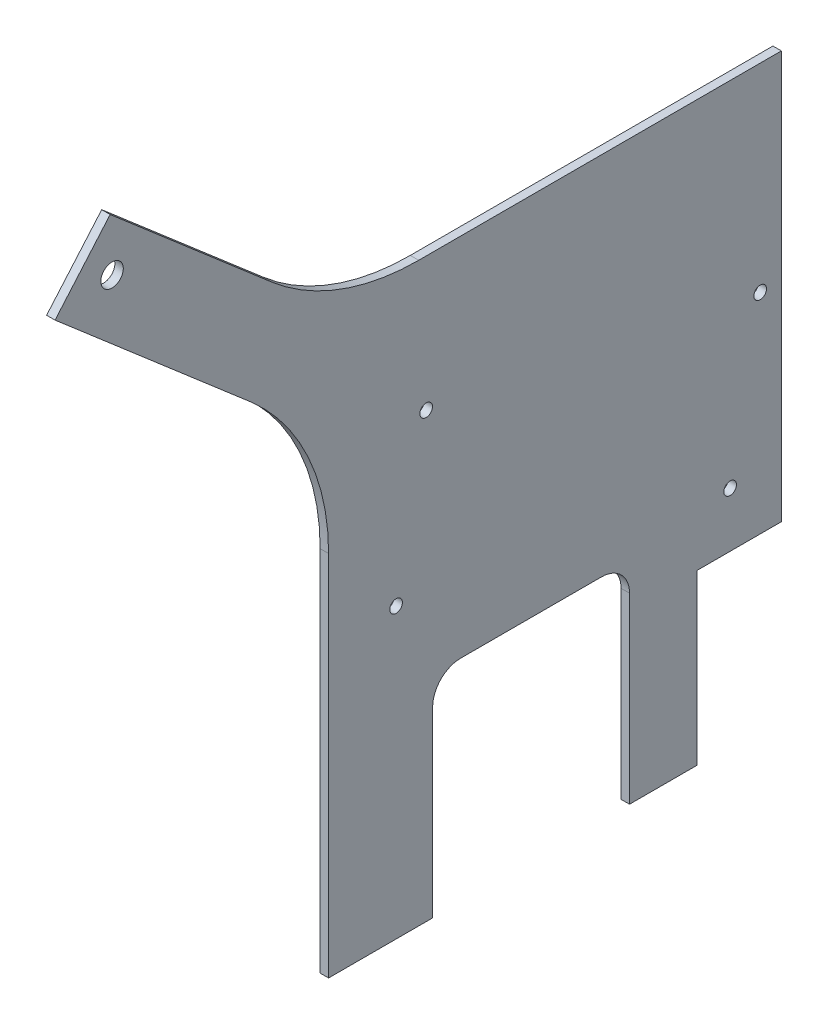
ISO-10303-21;
HEADER;
FILE_DESCRIPTION(('STEP AP214'),'2;1');
FILE_NAME('part.step','',(''),(''),'','','');
FILE_SCHEMA(('AUTOMOTIVE_DESIGN { 1 0 10303 214 1 1 1 1 }'));
ENDSEC;
DATA;
#1=APPLICATION_CONTEXT('core data for automotive mechanical design processes');
#2=APPLICATION_PROTOCOL_DEFINITION('international standard','automotive_design',2000,#1);
#3=PRODUCT_CONTEXT('',#1,'mechanical');
#4=PRODUCT('Part','Part','',(#3));
#5=PRODUCT_RELATED_PRODUCT_CATEGORY('part','',(#4));
#6=PRODUCT_DEFINITION_FORMATION('','',#4);
#7=PRODUCT_DEFINITION_CONTEXT('part definition',#1,'design');
#8=PRODUCT_DEFINITION('design','',#6,#7);
#9=PRODUCT_DEFINITION_SHAPE('','',#8);
#10=(LENGTH_UNIT() NAMED_UNIT(*) SI_UNIT(.MILLI.,.METRE.));
#11=(NAMED_UNIT(*) PLANE_ANGLE_UNIT() SI_UNIT($,.RADIAN.));
#12=(NAMED_UNIT(*) SI_UNIT($,.STERADIAN.) SOLID_ANGLE_UNIT());
#13=UNCERTAINTY_MEASURE_WITH_UNIT(LENGTH_MEASURE(1.E-05),#10,'distance_accuracy_value','');
#14=(GEOMETRIC_REPRESENTATION_CONTEXT(3) GLOBAL_UNCERTAINTY_ASSIGNED_CONTEXT((#13)) GLOBAL_UNIT_ASSIGNED_CONTEXT((#10,
#11,#12)) REPRESENTATION_CONTEXT('',''));
#15=CARTESIAN_POINT('',(0.,0.,0.));
#16=DIRECTION('',(0.,0.,1.));
#17=DIRECTION('',(1.,0.,0.));
#18=AXIS2_PLACEMENT_3D('',#15,#16,#17);
#19=CARTESIAN_POINT('',(1.5,0.,0.));
#20=DIRECTION('',(0.,1.,0.));
#21=DIRECTION('',(0.,0.,1.));
#22=AXIS2_PLACEMENT_3D('',#19,#20,#21);
#23=PLANE('',#22);
#24=DIRECTION('',(0.,0.,-1.));
#25=VECTOR('',#24,1.);
#26=CARTESIAN_POINT('',(-1.5,0.,0.));
#27=LINE('',#26,#25);
#28=CARTESIAN_POINT('',(-1.5,0.,0.));
#29=VERTEX_POINT('',#28);
#30=CARTESIAN_POINT('',(-1.5,0.,-37.));
#31=VERTEX_POINT('',#30);
#32=EDGE_CURVE('E310',#29,#31,#27,.T.);
#33=ORIENTED_EDGE('',*,*,#32,.T.);
#34=DIRECTION('',(1.,0.,0.));
#35=VECTOR('',#34,1.);
#36=CARTESIAN_POINT('',(-1.5,0.,-37.));
#37=LINE('',#36,#35);
#38=CARTESIAN_POINT('',(1.5,0.,-37.));
#39=VERTEX_POINT('',#38);
#40=EDGE_CURVE('E240',#31,#39,#37,.T.);
#41=ORIENTED_EDGE('',*,*,#40,.T.);
#42=DIRECTION('',(0.,0.,-1.));
#43=VECTOR('',#42,1.);
#44=CARTESIAN_POINT('',(1.5,0.,0.));
#45=LINE('',#44,#43);
#46=CARTESIAN_POINT('',(1.5,0.,0.));
#47=VERTEX_POINT('',#46);
#48=EDGE_CURVE('E285',#47,#39,#45,.T.);
#49=ORIENTED_EDGE('',*,*,#48,.F.);
#50=DIRECTION('',(-1.,0.,0.));
#51=VECTOR('',#50,1.);
#52=CARTESIAN_POINT('',(1.5,0.,0.));
#53=LINE('',#52,#51);
#54=EDGE_CURVE('E11',#47,#29,#53,.T.);
#55=ORIENTED_EDGE('',*,*,#54,.T.);
#56=EDGE_LOOP('',(#33,#41,#49,#55));
#57=FACE_BOUND('',#56,.T.);
#58=ADVANCED_FACE('F37',(#57),#23,.F.);
#59=CARTESIAN_POINT('',(1.5,130.720433702789,80.));
#60=DIRECTION('',(1.,0.,0.));
#61=DIRECTION('',(0.,0.,-1.));
#62=AXIS2_PLACEMENT_3D('',#59,#60,#61);
#63=PLANE('',#62);
#64=DIRECTION('',(0.,-1.,0.));
#65=VECTOR('',#64,1.);
#66=CARTESIAN_POINT('',(1.5,0.,-131.));
#67=LINE('',#66,#65);
#68=CARTESIAN_POINT('',(1.5,60.,-131.));
#69=VERTEX_POINT('',#68);
#70=CARTESIAN_POINT('',(1.5,0.,-131.));
#71=VERTEX_POINT('',#70);
#72=EDGE_CURVE('E193',#69,#71,#67,.T.);
#73=ORIENTED_EDGE('',*,*,#72,.F.);
#74=DIRECTION('',(0.,0.,1.));
#75=VECTOR('',#74,1.);
#76=CARTESIAN_POINT('',(1.5,60.,-161.));
#77=LINE('',#76,#75);
#78=CARTESIAN_POINT('',(1.5,60.,-161.));
#79=VERTEX_POINT('',#78);
#80=EDGE_CURVE('E173',#79,#69,#77,.T.);
#81=ORIENTED_EDGE('',*,*,#80,.F.);
#82=DIRECTION('',(0.,1.,0.));
#83=VECTOR('',#82,1.);
#84=CARTESIAN_POINT('',(1.5,0.,-161.));
#85=LINE('',#84,#83);
#86=CARTESIAN_POINT('',(1.5,205.,-161.));
#87=VERTEX_POINT('',#86);
#88=EDGE_CURVE('E289',#79,#87,#85,.T.);
#89=ORIENTED_EDGE('',*,*,#88,.T.);
#90=DIRECTION('',(0.,0.,1.));
#91=VECTOR('',#90,1.);
#92=CARTESIAN_POINT('',(1.5,205.,-32.0254453572531));
#93=LINE('',#92,#91);
#94=CARTESIAN_POINT('',(1.5,205.,-32.0254453572531));
#95=VERTEX_POINT('',#94);
#96=EDGE_CURVE('E291',#87,#95,#93,.T.);
#97=ORIENTED_EDGE('',*,*,#96,.T.);
#98=CARTESIAN_POINT('',(1.5,285.,-32.0254453572531));
#99=DIRECTION('',(-1.,0.,0.));
#100=DIRECTION('',(0.,0.,1.));
#101=AXIS2_PLACEMENT_3D('',#98,#99,#100);
#102=CIRCLE('',#101,80.);
#103=CARTESIAN_POINT('',(1.5,224.403033057894,20.2048868015352));
#104=VERTEX_POINT('',#103);
#105=EDGE_CURVE('E294',#95,#104,#102,.T.);
#106=ORIENTED_EDGE('',*,*,#105,.T.);
#107=DIRECTION('',(0.,0.652879151984854,0.75746208677632));
#108=VECTOR('',#107,1.);
#109=CARTESIAN_POINT('',(1.5,273.945625100142,77.6835718515051));
#110=LINE('',#109,#108);
#111=CARTESIAN_POINT('',(1.5,273.945625100142,77.6835718515051));
#112=VERTEX_POINT('',#111);
#113=EDGE_CURVE('E297',#104,#112,#110,.T.);
#114=ORIENTED_EDGE('',*,*,#113,.T.);
#115=DIRECTION('',(0.,-0.757462086776319,0.652879151984855));
#116=VECTOR('',#115,1.);
#117=CARTESIAN_POINT('',(1.5,251.221762496852,97.2699464110507));
#118=LINE('',#117,#116);
#119=CARTESIAN_POINT('',(1.5,251.221762496852,97.2699464110507));
#120=VERTEX_POINT('',#119);
#121=EDGE_CURVE('E299',#112,#120,#118,.T.);
#122=ORIENTED_EDGE('',*,*,#121,.T.);
#123=DIRECTION('',(0.,-0.652879151984855,-0.75746208677632));
#124=VECTOR('',#123,1.);
#125=CARTESIAN_POINT('',(1.5,191.317400644895,27.7696678412116));
#126=LINE('',#125,#124);
#127=CARTESIAN_POINT('',(1.5,191.317400644895,27.7696678412116));
#128=VERTEX_POINT('',#127);
#129=EDGE_CURVE('E301',#120,#128,#126,.T.);
#130=ORIENTED_EDGE('',*,*,#129,.T.);
#131=CARTESIAN_POINT('',(1.5,130.720433702789,80.));
#132=DIRECTION('',(-1.,0.,0.));
#133=DIRECTION('',(0.,0.,-1.));
#134=AXIS2_PLACEMENT_3D('',#131,#132,#133);
#135=CIRCLE('',#134,80.);
#136=CARTESIAN_POINT('',(1.5,130.720433702789,0.));
#137=VERTEX_POINT('',#136);
#138=EDGE_CURVE('E303',#128,#137,#135,.T.);
#139=ORIENTED_EDGE('',*,*,#138,.T.);
#140=DIRECTION('',(0.,-1.,0.));
#141=VECTOR('',#140,1.);
#142=CARTESIAN_POINT('',(1.5,0.,0.));
#143=LINE('',#142,#141);
#144=EDGE_CURVE('E279',#137,#47,#143,.T.);
#145=ORIENTED_EDGE('',*,*,#144,.T.);
#146=ORIENTED_EDGE('',*,*,#48,.T.);
#147=DIRECTION('',(0.,-1.,0.));
#148=VECTOR('',#147,1.);
#149=CARTESIAN_POINT('',(1.5,0.,-37.));
#150=LINE('',#149,#148);
#151=CARTESIAN_POINT('',(1.5,65.,-37.));
#152=VERTEX_POINT('',#151);
#153=EDGE_CURVE('E221',#152,#39,#150,.T.);
#154=ORIENTED_EDGE('',*,*,#153,.F.);
#155=CARTESIAN_POINT('',(1.5,65.,-47.));
#156=DIRECTION('',(1.,0.,0.));
#157=DIRECTION('',(0.,0.,-1.));
#158=AXIS2_PLACEMENT_3D('',#155,#156,#157);
#159=CIRCLE('',#158,10.);
#160=CARTESIAN_POINT('',(1.5,75.,-47.));
#161=VERTEX_POINT('',#160);
#162=EDGE_CURVE('E226',#161,#152,#159,.T.);
#163=ORIENTED_EDGE('',*,*,#162,.F.);
#164=DIRECTION('',(0.,0.,1.));
#165=VECTOR('',#164,1.);
#166=CARTESIAN_POINT('',(1.5,75.,-47.));
#167=LINE('',#166,#165);
#168=CARTESIAN_POINT('',(1.5,75.,-97.));
#169=VERTEX_POINT('',#168);
#170=EDGE_CURVE('E250',#169,#161,#167,.T.);
#171=ORIENTED_EDGE('',*,*,#170,.F.);
#172=CARTESIAN_POINT('',(1.5,65.,-97.));
#173=DIRECTION('',(1.,0.,0.));
#174=DIRECTION('',(0.,0.,1.));
#175=AXIS2_PLACEMENT_3D('',#172,#173,#174);
#176=CIRCLE('',#175,9.99999999999999);
#177=CARTESIAN_POINT('',(1.5,65.,-107.));
#178=VERTEX_POINT('',#177);
#179=EDGE_CURVE('E246',#178,#169,#176,.T.);
#180=ORIENTED_EDGE('',*,*,#179,.F.);
#181=DIRECTION('',(0.,1.,0.));
#182=VECTOR('',#181,1.);
#183=CARTESIAN_POINT('',(1.5,0.,-107.));
#184=LINE('',#183,#182);
#185=CARTESIAN_POINT('',(1.5,0.,-107.));
#186=VERTEX_POINT('',#185);
#187=EDGE_CURVE('E243',#186,#178,#184,.T.);
#188=ORIENTED_EDGE('',*,*,#187,.F.);
#189=EDGE_CURVE('E283',#186,#71,#45,.T.);
#190=ORIENTED_EDGE('',*,*,#189,.T.);
#191=EDGE_LOOP('',(#73,#81,#89,#97,#106,#114,#122,#130,#139,#145,#146,#154,#163,#171,#180,#188,#190));
#192=FACE_BOUND('',#191,.T.);
#193=CARTESIAN_POINT('',(1.5,157.500209204623,-34.69));
#194=DIRECTION('',(1.,0.,0.));
#195=DIRECTION('',(0.,0.,-1.));
#196=AXIS2_PLACEMENT_3D('',#193,#194,#195);
#197=CIRCLE('',#196,2.25);
#198=CARTESIAN_POINT('',(1.5,157.500209204623,-36.94));
#199=VERTEX_POINT('',#198);
#200=EDGE_CURVE('E200',#199,#199,#197,.T.);
#201=ORIENTED_EDGE('',*,*,#200,.F.);
#202=EDGE_LOOP('',(#201));
#203=FACE_BOUND('',#202,.T.);
#204=CARTESIAN_POINT('',(1.5,102.53,-24.));
#205=DIRECTION('',(1.,0.,0.));
#206=DIRECTION('',(0.,0.,-1.));
#207=AXIS2_PLACEMENT_3D('',#204,#205,#206);
#208=CIRCLE('',#207,2.25);
#209=CARTESIAN_POINT('',(1.5,102.53,-26.25));
#210=VERTEX_POINT('',#209);
#211=EDGE_CURVE('E206',#210,#210,#208,.T.);
#212=ORIENTED_EDGE('',*,*,#211,.F.);
#213=EDGE_LOOP('',(#212));
#214=FACE_BOUND('',#213,.T.);
#215=CARTESIAN_POINT('',(1.5,134.402173490337,-153.464916317131));
#216=DIRECTION('',(1.,0.,0.));
#217=DIRECTION('',(0.,0.,-1.));
#218=AXIS2_PLACEMENT_3D('',#215,#216,#217);
#219=CIRCLE('',#218,2.25);
#220=CARTESIAN_POINT('',(1.5,134.402173490337,-155.714916317131));
#221=VERTEX_POINT('',#220);
#222=EDGE_CURVE('E211',#221,#221,#219,.T.);
#223=ORIENTED_EDGE('',*,*,#222,.F.);
#224=EDGE_LOOP('',(#223));
#225=FACE_BOUND('',#224,.T.);
#226=CARTESIAN_POINT('',(1.5,79.4319642857143,-142.774916317131));
#227=DIRECTION('',(1.,0.,0.));
#228=DIRECTION('',(0.,0.,-1.));
#229=AXIS2_PLACEMENT_3D('',#226,#227,#228);
#230=CIRCLE('',#229,2.25);
#231=CARTESIAN_POINT('',(1.5,79.4319642857143,-145.024916317131));
#232=VERTEX_POINT('',#231);
#233=EDGE_CURVE('E215',#232,#232,#230,.T.);
#234=ORIENTED_EDGE('',*,*,#233,.F.);
#235=EDGE_LOOP('',(#234));
#236=FACE_BOUND('',#235,.T.);
#237=CARTESIAN_POINT('',(1.5,255.,77.));
#238=DIRECTION('',(1.,0.,0.));
#239=DIRECTION('',(0.,0.,-1.));
#240=AXIS2_PLACEMENT_3D('',#237,#238,#239);
#241=CIRCLE('',#240,4.00000000000001);
#242=CARTESIAN_POINT('',(1.5,255.,73.));
#243=VERTEX_POINT('',#242);
#244=EDGE_CURVE('E273',#243,#243,#241,.T.);
#245=ORIENTED_EDGE('',*,*,#244,.F.);
#246=EDGE_LOOP('',(#245));
#247=FACE_BOUND('',#246,.T.);
#248=ADVANCED_FACE('F370',(#192,#203,#214,#225,#236,#247),#63,.T.);
#249=CARTESIAN_POINT('',(-1.5,130.720433702789,80.));
#250=DIRECTION('',(1.,0.,0.));
#251=DIRECTION('',(0.,0.,-1.));
#252=AXIS2_PLACEMENT_3D('',#249,#250,#251);
#253=PLANE('',#252);
#254=CARTESIAN_POINT('',(-1.5,157.500209204623,-34.69));
#255=DIRECTION('',(1.,0.,0.));
#256=DIRECTION('',(0.,0.,-1.));
#257=AXIS2_PLACEMENT_3D('',#254,#255,#256);
#258=CIRCLE('',#257,2.25);
#259=CARTESIAN_POINT('',(-1.5,157.500209204623,-36.94));
#260=VERTEX_POINT('',#259);
#261=EDGE_CURVE('E41',#260,#260,#258,.T.);
#262=ORIENTED_EDGE('',*,*,#261,.T.);
#263=EDGE_LOOP('',(#262));
#264=FACE_BOUND('',#263,.T.);
#265=CARTESIAN_POINT('',(-1.5,102.53,-24.));
#266=DIRECTION('',(1.,0.,0.));
#267=DIRECTION('',(0.,0.,-1.));
#268=AXIS2_PLACEMENT_3D('',#265,#266,#267);
#269=CIRCLE('',#268,2.25);
#270=CARTESIAN_POINT('',(-1.5,102.53,-26.25));
#271=VERTEX_POINT('',#270);
#272=EDGE_CURVE('E210',#271,#271,#269,.T.);
#273=ORIENTED_EDGE('',*,*,#272,.T.);
#274=EDGE_LOOP('',(#273));
#275=FACE_BOUND('',#274,.T.);
#276=CARTESIAN_POINT('',(-1.5,134.402173490337,-153.464916317131));
#277=DIRECTION('',(1.,0.,0.));
#278=DIRECTION('',(0.,0.,-1.));
#279=AXIS2_PLACEMENT_3D('',#276,#277,#278);
#280=CIRCLE('',#279,2.25);
#281=CARTESIAN_POINT('',(-1.5,134.402173490337,-155.714916317131));
#282=VERTEX_POINT('',#281);
#283=EDGE_CURVE('E214',#282,#282,#280,.T.);
#284=ORIENTED_EDGE('',*,*,#283,.T.);
#285=EDGE_LOOP('',(#284));
#286=FACE_BOUND('',#285,.T.);
#287=CARTESIAN_POINT('',(-1.5,79.4319642857143,-142.774916317131));
#288=DIRECTION('',(1.,0.,0.));
#289=DIRECTION('',(0.,0.,-1.));
#290=AXIS2_PLACEMENT_3D('',#287,#288,#289);
#291=CIRCLE('',#290,2.25);
#292=CARTESIAN_POINT('',(-1.5,79.4319642857143,-145.024916317131));
#293=VERTEX_POINT('',#292);
#294=EDGE_CURVE('E218',#293,#293,#291,.T.);
#295=ORIENTED_EDGE('',*,*,#294,.T.);
#296=EDGE_LOOP('',(#295));
#297=FACE_BOUND('',#296,.T.);
#298=DIRECTION('',(0.,0.,1.));
#299=VECTOR('',#298,1.);
#300=CARTESIAN_POINT('',(-1.5,60.,-161.));
#301=LINE('',#300,#299);
#302=CARTESIAN_POINT('',(-1.5,60.,-161.));
#303=VERTEX_POINT('',#302);
#304=CARTESIAN_POINT('',(-1.5,60.,-131.));
#305=VERTEX_POINT('',#304);
#306=EDGE_CURVE('E55',#303,#305,#301,.T.);
#307=ORIENTED_EDGE('',*,*,#306,.T.);
#308=DIRECTION('',(0.,-1.,0.));
#309=VECTOR('',#308,1.);
#310=CARTESIAN_POINT('',(-1.5,0.,-131.));
#311=LINE('',#310,#309);
#312=CARTESIAN_POINT('',(-1.5,0.,-131.));
#313=VERTEX_POINT('',#312);
#314=EDGE_CURVE('E180',#305,#313,#311,.T.);
#315=ORIENTED_EDGE('',*,*,#314,.T.);
#316=CARTESIAN_POINT('',(-1.5,0.,-107.));
#317=VERTEX_POINT('',#316);
#318=EDGE_CURVE('E309',#317,#313,#27,.T.);
#319=ORIENTED_EDGE('',*,*,#318,.F.);
#320=DIRECTION('',(0.,1.,0.));
#321=VECTOR('',#320,1.);
#322=CARTESIAN_POINT('',(-1.5,0.,-107.));
#323=LINE('',#322,#321);
#324=CARTESIAN_POINT('',(-1.5,65.,-107.));
#325=VERTEX_POINT('',#324);
#326=EDGE_CURVE('E63',#317,#325,#323,.T.);
#327=ORIENTED_EDGE('',*,*,#326,.T.);
#328=CARTESIAN_POINT('',(-1.5,65.,-97.));
#329=DIRECTION('',(1.,0.,0.));
#330=DIRECTION('',(0.,0.,1.));
#331=AXIS2_PLACEMENT_3D('',#328,#329,#330);
#332=CIRCLE('',#331,9.99999999999999);
#333=CARTESIAN_POINT('',(-1.5,75.,-97.));
#334=VERTEX_POINT('',#333);
#335=EDGE_CURVE('E228',#325,#334,#332,.T.);
#336=ORIENTED_EDGE('',*,*,#335,.T.);
#337=DIRECTION('',(0.,0.,1.));
#338=VECTOR('',#337,1.);
#339=CARTESIAN_POINT('',(-1.5,75.,-47.));
#340=LINE('',#339,#338);
#341=CARTESIAN_POINT('',(-1.5,75.,-47.));
#342=VERTEX_POINT('',#341);
#343=EDGE_CURVE('E232',#334,#342,#340,.T.);
#344=ORIENTED_EDGE('',*,*,#343,.T.);
#345=CARTESIAN_POINT('',(-1.5,65.,-47.));
#346=DIRECTION('',(1.,0.,0.));
#347=DIRECTION('',(0.,0.,-1.));
#348=AXIS2_PLACEMENT_3D('',#345,#346,#347);
#349=CIRCLE('',#348,10.);
#350=CARTESIAN_POINT('',(-1.5,65.,-37.));
#351=VERTEX_POINT('',#350);
#352=EDGE_CURVE('E236',#342,#351,#349,.T.);
#353=ORIENTED_EDGE('',*,*,#352,.T.);
#354=DIRECTION('',(0.,-1.,0.));
#355=VECTOR('',#354,1.);
#356=CARTESIAN_POINT('',(-1.5,0.,-37.));
#357=LINE('',#356,#355);
#358=EDGE_CURVE('E222',#351,#31,#357,.T.);
#359=ORIENTED_EDGE('',*,*,#358,.T.);
#360=ORIENTED_EDGE('',*,*,#32,.F.);
#361=DIRECTION('',(0.,-1.,0.));
#362=VECTOR('',#361,1.);
#363=CARTESIAN_POINT('',(-1.5,0.,0.));
#364=LINE('',#363,#362);
#365=CARTESIAN_POINT('',(-1.5,130.720433702789,0.));
#366=VERTEX_POINT('',#365);
#367=EDGE_CURVE('E276',#366,#29,#364,.T.);
#368=ORIENTED_EDGE('',*,*,#367,.F.);
#369=CARTESIAN_POINT('',(-1.5,130.720433702789,80.));
#370=DIRECTION('',(-1.,0.,0.));
#371=DIRECTION('',(0.,0.,-1.));
#372=AXIS2_PLACEMENT_3D('',#369,#370,#371);
#373=CIRCLE('',#372,80.);
#374=CARTESIAN_POINT('',(-1.5,191.317400644895,27.7696678412116));
#375=VERTEX_POINT('',#374);
#376=EDGE_CURVE('E284',#375,#366,#373,.T.);
#377=ORIENTED_EDGE('',*,*,#376,.F.);
#378=DIRECTION('',(0.,-0.652879151984855,-0.75746208677632));
#379=VECTOR('',#378,1.);
#380=CARTESIAN_POINT('',(-1.5,191.317400644895,27.7696678412116));
#381=LINE('',#380,#379);
#382=CARTESIAN_POINT('',(-1.5,251.221762496852,97.2699464110507));
#383=VERTEX_POINT('',#382);
#384=EDGE_CURVE('E325',#383,#375,#381,.T.);
#385=ORIENTED_EDGE('',*,*,#384,.F.);
#386=DIRECTION('',(0.,-0.757462086776319,0.652879151984855));
#387=VECTOR('',#386,1.);
#388=CARTESIAN_POINT('',(-1.5,251.221762496852,97.2699464110507));
#389=LINE('',#388,#387);
#390=CARTESIAN_POINT('',(-1.5,273.945625100142,77.6835718515051));
#391=VERTEX_POINT('',#390);
#392=EDGE_CURVE('E323',#391,#383,#389,.T.);
#393=ORIENTED_EDGE('',*,*,#392,.F.);
#394=DIRECTION('',(0.,0.652879151984854,0.75746208677632));
#395=VECTOR('',#394,1.);
#396=CARTESIAN_POINT('',(-1.5,273.945625100142,77.6835718515051));
#397=LINE('',#396,#395);
#398=CARTESIAN_POINT('',(-1.5,224.403033057894,20.2048868015352));
#399=VERTEX_POINT('',#398);
#400=EDGE_CURVE('E321',#399,#391,#397,.T.);
#401=ORIENTED_EDGE('',*,*,#400,.F.);
#402=CARTESIAN_POINT('',(-1.5,285.,-32.0254453572531));
#403=DIRECTION('',(-1.,0.,0.));
#404=DIRECTION('',(0.,0.,1.));
#405=AXIS2_PLACEMENT_3D('',#402,#403,#404);
#406=CIRCLE('',#405,80.);
#407=CARTESIAN_POINT('',(-1.5,205.,-32.0254453572531));
#408=VERTEX_POINT('',#407);
#409=EDGE_CURVE('E318',#408,#399,#406,.T.);
#410=ORIENTED_EDGE('',*,*,#409,.F.);
#411=DIRECTION('',(0.,0.,1.));
#412=VECTOR('',#411,1.);
#413=CARTESIAN_POINT('',(-1.5,205.,-32.0254453572531));
#414=LINE('',#413,#412);
#415=CARTESIAN_POINT('',(-1.5,205.,-161.));
#416=VERTEX_POINT('',#415);
#417=EDGE_CURVE('E315',#416,#408,#414,.T.);
#418=ORIENTED_EDGE('',*,*,#417,.F.);
#419=DIRECTION('',(0.,1.,0.));
#420=VECTOR('',#419,1.);
#421=CARTESIAN_POINT('',(-1.5,0.,-161.));
#422=LINE('',#421,#420);
#423=EDGE_CURVE('E192',#303,#416,#422,.T.);
#424=ORIENTED_EDGE('',*,*,#423,.F.);
#425=EDGE_LOOP('',(#307,#315,#319,#327,#336,#344,#353,#359,#360,#368,#377,#385,#393,#401,#410,
#418,#424));
#426=FACE_BOUND('',#425,.T.);
#427=CARTESIAN_POINT('',(-1.5,255.,77.));
#428=DIRECTION('',(1.,0.,0.));
#429=DIRECTION('',(0.,0.,-1.));
#430=AXIS2_PLACEMENT_3D('',#427,#428,#429);
#431=CIRCLE('',#430,4.00000000000001);
#432=CARTESIAN_POINT('',(-1.5,255.,73.));
#433=VERTEX_POINT('',#432);
#434=EDGE_CURVE('E260',#433,#433,#431,.T.);
#435=ORIENTED_EDGE('',*,*,#434,.T.);
#436=EDGE_LOOP('',(#435));
#437=FACE_BOUND('',#436,.T.);
#438=ADVANCED_FACE('F189',(#264,#275,#286,#297,#426,#437),#253,.F.);
#439=CARTESIAN_POINT('',(1.5,0.,0.));
#440=DIRECTION('',(0.,0.,-1.));
#441=DIRECTION('',(-1.,0.,0.));
#442=AXIS2_PLACEMENT_3D('',#439,#440,#441);
#443=PLANE('',#442);
#444=ORIENTED_EDGE('',*,*,#367,.T.);
#445=ORIENTED_EDGE('',*,*,#54,.F.);
#446=ORIENTED_EDGE('',*,*,#144,.F.);
#447=DIRECTION('',(-1.,0.,0.));
#448=VECTOR('',#447,1.);
#449=CARTESIAN_POINT('',(1.5,130.720433702789,0.));
#450=LINE('',#449,#448);
#451=EDGE_CURVE('E305',#137,#366,#450,.T.);
#452=ORIENTED_EDGE('',*,*,#451,.T.);
#453=EDGE_LOOP('',(#444,#445,#446,#452));
#454=FACE_BOUND('',#453,.T.);
#455=ADVANCED_FACE('F39',(#454),#443,.F.);
#456=ORIENTED_EDGE('',*,*,#318,.T.);
#457=DIRECTION('',(1.,0.,0.));
#458=VECTOR('',#457,1.);
#459=CARTESIAN_POINT('',(-1.5,0.,-131.));
#460=LINE('',#459,#458);
#461=EDGE_CURVE('E176',#313,#71,#460,.T.);
#462=ORIENTED_EDGE('',*,*,#461,.T.);
#463=ORIENTED_EDGE('',*,*,#189,.F.);
#464=DIRECTION('',(1.,0.,0.));
#465=VECTOR('',#464,1.);
#466=CARTESIAN_POINT('',(-1.5,0.,-107.));
#467=LINE('',#466,#465);
#468=EDGE_CURVE('E269',#317,#186,#467,.T.);
#469=ORIENTED_EDGE('',*,*,#468,.F.);
#470=EDGE_LOOP('',(#456,#462,#463,#469));
#471=FACE_BOUND('',#470,.T.);
#472=ADVANCED_FACE('F372',(#471),#23,.F.);
#473=CARTESIAN_POINT('',(1.5,0.,-161.));
#474=DIRECTION('',(0.,0.,1.));
#475=DIRECTION('',(1.,0.,0.));
#476=AXIS2_PLACEMENT_3D('',#473,#474,#475);
#477=PLANE('',#476);
#478=ORIENTED_EDGE('',*,*,#88,.F.);
#479=DIRECTION('',(1.,0.,0.));
#480=VECTOR('',#479,1.);
#481=CARTESIAN_POINT('',(-1.5,60.,-161.));
#482=LINE('',#481,#480);
#483=EDGE_CURVE('E177',#303,#79,#482,.T.);
#484=ORIENTED_EDGE('',*,*,#483,.F.);
#485=ORIENTED_EDGE('',*,*,#423,.T.);
#486=DIRECTION('',(-1.,0.,0.));
#487=VECTOR('',#486,1.);
#488=CARTESIAN_POINT('',(1.5,205.,-161.));
#489=LINE('',#488,#487);
#490=EDGE_CURVE('E47',#87,#416,#489,.T.);
#491=ORIENTED_EDGE('',*,*,#490,.F.);
#492=EDGE_LOOP('',(#478,#484,#485,#491));
#493=FACE_BOUND('',#492,.T.);
#494=ADVANCED_FACE('F380',(#493),#477,.F.);
#495=CARTESIAN_POINT('',(1.5,205.,-32.0254453572531));
#496=DIRECTION('',(0.,-1.,0.));
#497=DIRECTION('',(0.,0.,-1.));
#498=AXIS2_PLACEMENT_3D('',#495,#496,#497);
#499=PLANE('',#498);
#500=ORIENTED_EDGE('',*,*,#417,.T.);
#501=DIRECTION('',(-1.,0.,0.));
#502=VECTOR('',#501,1.);
#503=CARTESIAN_POINT('',(1.5,205.,-32.0254453572531));
#504=LINE('',#503,#502);
#505=EDGE_CURVE('E342',#95,#408,#504,.T.);
#506=ORIENTED_EDGE('',*,*,#505,.F.);
#507=ORIENTED_EDGE('',*,*,#96,.F.);
#508=ORIENTED_EDGE('',*,*,#490,.T.);
#509=EDGE_LOOP('',(#500,#506,#507,#508));
#510=FACE_BOUND('',#509,.T.);
#511=ADVANCED_FACE('F386',(#510),#499,.F.);
#512=CARTESIAN_POINT('',(1.5,285.,-32.0254453572531));
#513=DIRECTION('',(-1.,0.,0.));
#514=DIRECTION('',(0.,0.,1.));
#515=AXIS2_PLACEMENT_3D('',#512,#513,#514);
#516=CYLINDRICAL_SURFACE('',#515,80.);
#517=ORIENTED_EDGE('',*,*,#409,.T.);
#518=DIRECTION('',(-1.,0.,0.));
#519=VECTOR('',#518,1.);
#520=CARTESIAN_POINT('',(1.5,224.403033057894,20.2048868015352));
#521=LINE('',#520,#519);
#522=EDGE_CURVE('E339',#104,#399,#521,.T.);
#523=ORIENTED_EDGE('',*,*,#522,.F.);
#524=ORIENTED_EDGE('',*,*,#105,.F.);
#525=ORIENTED_EDGE('',*,*,#505,.T.);
#526=EDGE_LOOP('',(#517,#523,#524,#525));
#527=FACE_BOUND('',#526,.T.);
#528=ADVANCED_FACE('F420',(#527),#516,.F.);
#529=CARTESIAN_POINT('',(1.5,273.945625100142,77.6835718515051));
#530=DIRECTION('',(0.,-0.75746208677632,0.652879151984854));
#531=DIRECTION('',(0.,-0.652879151984854,-0.75746208677632));
#532=AXIS2_PLACEMENT_3D('',#529,#530,#531);
#533=PLANE('',#532);
#534=ORIENTED_EDGE('',*,*,#400,.T.);
#535=DIRECTION('',(-1.,0.,0.));
#536=VECTOR('',#535,1.);
#537=CARTESIAN_POINT('',(1.5,273.945625100142,77.6835718515051));
#538=LINE('',#537,#536);
#539=EDGE_CURVE('E336',#112,#391,#538,.T.);
#540=ORIENTED_EDGE('',*,*,#539,.F.);
#541=ORIENTED_EDGE('',*,*,#113,.F.);
#542=ORIENTED_EDGE('',*,*,#522,.T.);
#543=EDGE_LOOP('',(#534,#540,#541,#542));
#544=FACE_BOUND('',#543,.T.);
#545=ADVANCED_FACE('F416',(#544),#533,.F.);
#546=CARTESIAN_POINT('',(1.5,251.221762496852,97.2699464110507));
#547=DIRECTION('',(0.,-0.652879151984855,-0.757462086776319));
#548=DIRECTION('',(0.,0.757462086776319,-0.652879151984855));
#549=AXIS2_PLACEMENT_3D('',#546,#547,#548);
#550=PLANE('',#549);
#551=ORIENTED_EDGE('',*,*,#392,.T.);
#552=DIRECTION('',(-1.,0.,0.));
#553=VECTOR('',#552,1.);
#554=CARTESIAN_POINT('',(1.5,251.221762496852,97.2699464110507));
#555=LINE('',#554,#553);
#556=EDGE_CURVE('E333',#120,#383,#555,.T.);
#557=ORIENTED_EDGE('',*,*,#556,.F.);
#558=ORIENTED_EDGE('',*,*,#121,.F.);
#559=ORIENTED_EDGE('',*,*,#539,.T.);
#560=EDGE_LOOP('',(#551,#557,#558,#559));
#561=FACE_BOUND('',#560,.T.);
#562=ADVANCED_FACE('F412',(#561),#550,.F.);
#563=CARTESIAN_POINT('',(1.5,191.317400644895,27.7696678412116));
#564=DIRECTION('',(0.,0.75746208677632,-0.652879151984855));
#565=DIRECTION('',(0.,0.652879151984855,0.75746208677632));
#566=AXIS2_PLACEMENT_3D('',#563,#564,#565);
#567=PLANE('',#566);
#568=ORIENTED_EDGE('',*,*,#384,.T.);
#569=DIRECTION('',(-1.,0.,0.));
#570=VECTOR('',#569,1.);
#571=CARTESIAN_POINT('',(1.5,191.317400644895,27.7696678412116));
#572=LINE('',#571,#570);
#573=EDGE_CURVE('E330',#128,#375,#572,.T.);
#574=ORIENTED_EDGE('',*,*,#573,.F.);
#575=ORIENTED_EDGE('',*,*,#129,.F.);
#576=ORIENTED_EDGE('',*,*,#556,.T.);
#577=EDGE_LOOP('',(#568,#574,#575,#576));
#578=FACE_BOUND('',#577,.T.);
#579=ADVANCED_FACE('F408',(#578),#567,.F.);
#580=CARTESIAN_POINT('',(1.5,130.720433702789,80.));
#581=DIRECTION('',(-1.,0.,0.));
#582=DIRECTION('',(0.,0.,1.));
#583=AXIS2_PLACEMENT_3D('',#580,#581,#582);
#584=CYLINDRICAL_SURFACE('',#583,80.);
#585=ORIENTED_EDGE('',*,*,#376,.T.);
#586=ORIENTED_EDGE('',*,*,#451,.F.);
#587=ORIENTED_EDGE('',*,*,#138,.F.);
#588=ORIENTED_EDGE('',*,*,#573,.T.);
#589=EDGE_LOOP('',(#585,#586,#587,#588));
#590=FACE_BOUND('',#589,.T.);
#591=ADVANCED_FACE('F404',(#590),#584,.F.);
#592=CARTESIAN_POINT('',(1.5,255.,77.));
#593=DIRECTION('',(-1.,0.,0.));
#594=DIRECTION('',(0.,0.,1.));
#595=AXIS2_PLACEMENT_3D('',#592,#593,#594);
#596=CYLINDRICAL_SURFACE('',#595,4.00000000000001);
#597=ORIENTED_EDGE('',*,*,#244,.T.);
#598=EDGE_LOOP('',(#597));
#599=FACE_BOUND('',#598,.T.);
#600=ORIENTED_EDGE('',*,*,#434,.F.);
#601=EDGE_LOOP('',(#600));
#602=FACE_BOUND('',#601,.T.);
#603=ADVANCED_FACE('F407',(#599,#602),#596,.F.);
#604=CARTESIAN_POINT('',(-1.5,0.,-37.));
#605=DIRECTION('',(0.,0.,1.));
#606=DIRECTION('',(1.,0.,0.));
#607=AXIS2_PLACEMENT_3D('',#604,#605,#606);
#608=PLANE('',#607);
#609=ORIENTED_EDGE('',*,*,#153,.T.);
#610=ORIENTED_EDGE('',*,*,#40,.F.);
#611=ORIENTED_EDGE('',*,*,#358,.F.);
#612=DIRECTION('',(1.,0.,0.));
#613=VECTOR('',#612,1.);
#614=CARTESIAN_POINT('',(-1.5,65.,-37.));
#615=LINE('',#614,#613);
#616=EDGE_CURVE('E257',#351,#152,#615,.T.);
#617=ORIENTED_EDGE('',*,*,#616,.T.);
#618=EDGE_LOOP('',(#609,#610,#611,#617));
#619=FACE_BOUND('',#618,.T.);
#620=ADVANCED_FACE('F463',(#619),#608,.F.);
#621=CARTESIAN_POINT('',(-1.5,65.,-47.));
#622=DIRECTION('',(1.,0.,0.));
#623=DIRECTION('',(0.,0.,-1.));
#624=AXIS2_PLACEMENT_3D('',#621,#622,#623);
#625=CYLINDRICAL_SURFACE('',#624,10.);
#626=ORIENTED_EDGE('',*,*,#162,.T.);
#627=ORIENTED_EDGE('',*,*,#616,.F.);
#628=ORIENTED_EDGE('',*,*,#352,.F.);
#629=DIRECTION('',(1.,0.,0.));
#630=VECTOR('',#629,1.);
#631=CARTESIAN_POINT('',(-1.5,75.,-47.));
#632=LINE('',#631,#630);
#633=EDGE_CURVE('E261',#342,#161,#632,.T.);
#634=ORIENTED_EDGE('',*,*,#633,.T.);
#635=EDGE_LOOP('',(#626,#627,#628,#634));
#636=FACE_BOUND('',#635,.T.);
#637=ADVANCED_FACE('F459',(#636),#625,.F.);
#638=CARTESIAN_POINT('',(-1.5,75.,-47.));
#639=DIRECTION('',(0.,1.,0.));
#640=DIRECTION('',(0.,0.,1.));
#641=AXIS2_PLACEMENT_3D('',#638,#639,#640);
#642=PLANE('',#641);
#643=ORIENTED_EDGE('',*,*,#170,.T.);
#644=ORIENTED_EDGE('',*,*,#633,.F.);
#645=ORIENTED_EDGE('',*,*,#343,.F.);
#646=DIRECTION('',(1.,0.,0.));
#647=VECTOR('',#646,1.);
#648=CARTESIAN_POINT('',(-1.5,75.,-97.));
#649=LINE('',#648,#647);
#650=EDGE_CURVE('E264',#334,#169,#649,.T.);
#651=ORIENTED_EDGE('',*,*,#650,.T.);
#652=EDGE_LOOP('',(#643,#644,#645,#651));
#653=FACE_BOUND('',#652,.T.);
#654=ADVANCED_FACE('F456',(#653),#642,.F.);
#655=CARTESIAN_POINT('',(-1.5,65.,-97.));
#656=DIRECTION('',(1.,0.,0.));
#657=DIRECTION('',(0.,0.,-1.));
#658=AXIS2_PLACEMENT_3D('',#655,#656,#657);
#659=CYLINDRICAL_SURFACE('',#658,9.99999999999999);
#660=ORIENTED_EDGE('',*,*,#179,.T.);
#661=ORIENTED_EDGE('',*,*,#650,.F.);
#662=ORIENTED_EDGE('',*,*,#335,.F.);
#663=DIRECTION('',(1.,0.,0.));
#664=VECTOR('',#663,1.);
#665=CARTESIAN_POINT('',(-1.5,65.,-107.));
#666=LINE('',#665,#664);
#667=EDGE_CURVE('E267',#325,#178,#666,.T.);
#668=ORIENTED_EDGE('',*,*,#667,.T.);
#669=EDGE_LOOP('',(#660,#661,#662,#668));
#670=FACE_BOUND('',#669,.T.);
#671=ADVANCED_FACE('F452',(#670),#659,.F.);
#672=CARTESIAN_POINT('',(-1.5,0.,-107.));
#673=DIRECTION('',(0.,0.,-1.));
#674=DIRECTION('',(-1.,0.,0.));
#675=AXIS2_PLACEMENT_3D('',#672,#673,#674);
#676=PLANE('',#675);
#677=ORIENTED_EDGE('',*,*,#187,.T.);
#678=ORIENTED_EDGE('',*,*,#667,.F.);
#679=ORIENTED_EDGE('',*,*,#326,.F.);
#680=ORIENTED_EDGE('',*,*,#468,.T.);
#681=EDGE_LOOP('',(#677,#678,#679,#680));
#682=FACE_BOUND('',#681,.T.);
#683=ADVANCED_FACE('F449',(#682),#676,.F.);
#684=CARTESIAN_POINT('',(1.5,79.4319642857143,-142.774916317131));
#685=DIRECTION('',(1.,0.,0.));
#686=DIRECTION('',(0.,0.,-1.));
#687=AXIS2_PLACEMENT_3D('',#684,#685,#686);
#688=CYLINDRICAL_SURFACE('',#687,2.25);
#689=ORIENTED_EDGE('',*,*,#233,.T.);
#690=EDGE_LOOP('',(#689));
#691=FACE_BOUND('',#690,.T.);
#692=ORIENTED_EDGE('',*,*,#294,.F.);
#693=EDGE_LOOP('',(#692));
#694=FACE_BOUND('',#693,.T.);
#695=ADVANCED_FACE('F366',(#691,#694),#688,.F.);
#696=CARTESIAN_POINT('',(1.5,134.402173490337,-153.464916317131));
#697=DIRECTION('',(1.,0.,0.));
#698=DIRECTION('',(0.,0.,-1.));
#699=AXIS2_PLACEMENT_3D('',#696,#697,#698);
#700=CYLINDRICAL_SURFACE('',#699,2.25);
#701=ORIENTED_EDGE('',*,*,#222,.T.);
#702=EDGE_LOOP('',(#701));
#703=FACE_BOUND('',#702,.T.);
#704=ORIENTED_EDGE('',*,*,#283,.F.);
#705=EDGE_LOOP('',(#704));
#706=FACE_BOUND('',#705,.T.);
#707=ADVANCED_FACE('F357',(#703,#706),#700,.F.);
#708=CARTESIAN_POINT('',(1.5,102.53,-24.));
#709=DIRECTION('',(1.,0.,0.));
#710=DIRECTION('',(0.,0.,-1.));
#711=AXIS2_PLACEMENT_3D('',#708,#709,#710);
#712=CYLINDRICAL_SURFACE('',#711,2.25);
#713=ORIENTED_EDGE('',*,*,#211,.T.);
#714=EDGE_LOOP('',(#713));
#715=FACE_BOUND('',#714,.T.);
#716=ORIENTED_EDGE('',*,*,#272,.F.);
#717=EDGE_LOOP('',(#716));
#718=FACE_BOUND('',#717,.T.);
#719=ADVANCED_FACE('F354',(#715,#718),#712,.F.);
#720=CARTESIAN_POINT('',(1.5,157.500209204623,-34.69));
#721=DIRECTION('',(1.,0.,0.));
#722=DIRECTION('',(0.,0.,-1.));
#723=AXIS2_PLACEMENT_3D('',#720,#721,#722);
#724=CYLINDRICAL_SURFACE('',#723,2.25);
#725=ORIENTED_EDGE('',*,*,#200,.T.);
#726=EDGE_LOOP('',(#725));
#727=FACE_BOUND('',#726,.T.);
#728=ORIENTED_EDGE('',*,*,#261,.F.);
#729=EDGE_LOOP('',(#728));
#730=FACE_BOUND('',#729,.T.);
#731=ADVANCED_FACE('F356',(#727,#730),#724,.F.);
#732=CARTESIAN_POINT('',(-1.5,0.,-131.));
#733=DIRECTION('',(0.,0.,1.));
#734=DIRECTION('',(1.,0.,0.));
#735=AXIS2_PLACEMENT_3D('',#732,#733,#734);
#736=PLANE('',#735);
#737=ORIENTED_EDGE('',*,*,#72,.T.);
#738=ORIENTED_EDGE('',*,*,#461,.F.);
#739=ORIENTED_EDGE('',*,*,#314,.F.);
#740=DIRECTION('',(1.,0.,0.));
#741=VECTOR('',#740,1.);
#742=CARTESIAN_POINT('',(-1.5,60.,-131.));
#743=LINE('',#742,#741);
#744=EDGE_CURVE('E169',#305,#69,#743,.T.);
#745=ORIENTED_EDGE('',*,*,#744,.T.);
#746=EDGE_LOOP('',(#737,#738,#739,#745));
#747=FACE_BOUND('',#746,.T.);
#748=ADVANCED_FACE('F181',(#747),#736,.F.);
#749=CARTESIAN_POINT('',(-1.5,60.,-161.));
#750=DIRECTION('',(0.,1.,0.));
#751=DIRECTION('',(0.,0.,1.));
#752=AXIS2_PLACEMENT_3D('',#749,#750,#751);
#753=PLANE('',#752);
#754=ORIENTED_EDGE('',*,*,#80,.T.);
#755=ORIENTED_EDGE('',*,*,#744,.F.);
#756=ORIENTED_EDGE('',*,*,#306,.F.);
#757=ORIENTED_EDGE('',*,*,#483,.T.);
#758=EDGE_LOOP('',(#754,#755,#756,#757));
#759=FACE_BOUND('',#758,.T.);
#760=ADVANCED_FACE('F171',(#759),#753,.F.);
#761=CLOSED_SHELL('',(#58,#248,#438,#455,#472,#494,#511,#528,#545,#562,#579,#591,#603,#620,#637,
#654,#671,#683,#695,#707,#719,#731,#748,#760));
#762=MANIFOLD_SOLID_BREP('B2',#761);
#763=ADVANCED_BREP_SHAPE_REPRESENTATION('',(#18,#762),#14);
#764=SHAPE_DEFINITION_REPRESENTATION(#9,#763);
ENDSEC;
END-ISO-10303-21;
